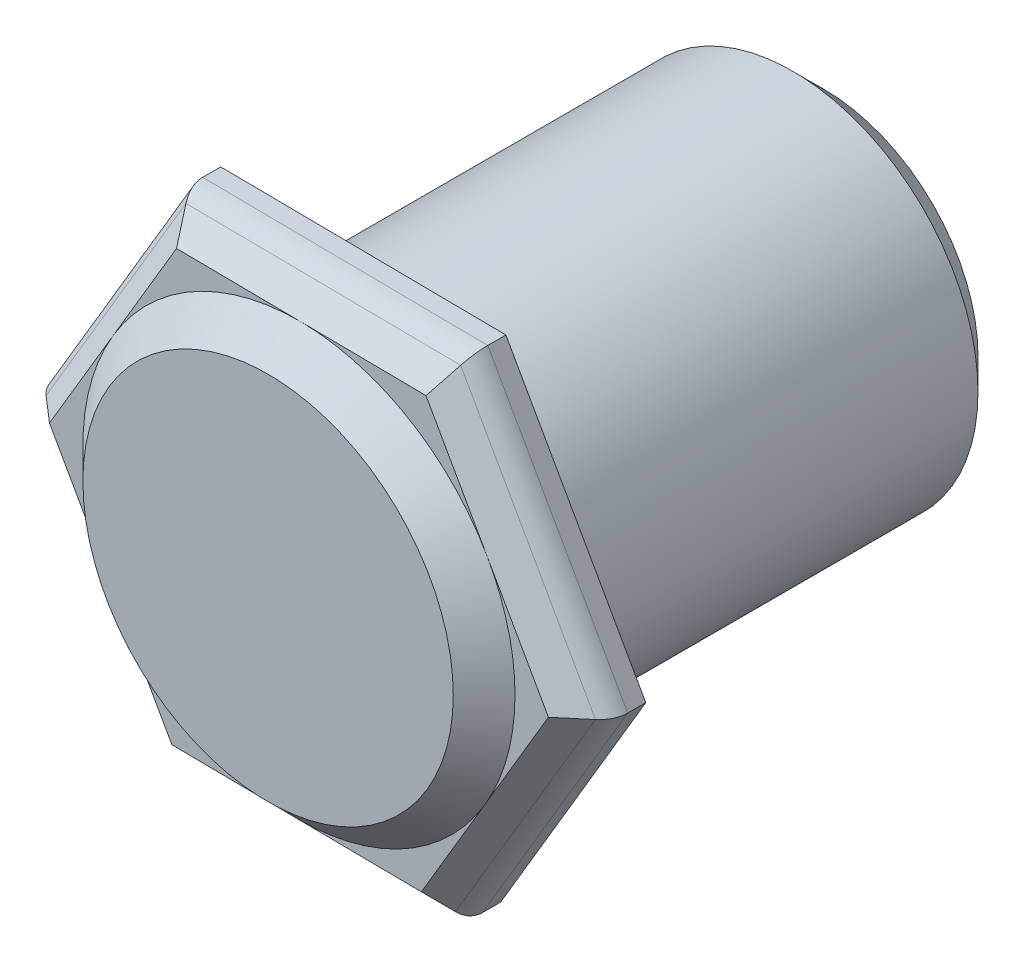
ISO-10303-21;
HEADER;
FILE_DESCRIPTION(('STEP AP214'),'2;1');
FILE_NAME('part.step','',(''),(''),'','','');
FILE_SCHEMA(('AUTOMOTIVE_DESIGN { 1 0 10303 214 1 1 1 1 }'));
ENDSEC;
DATA;
#1=APPLICATION_CONTEXT('core data for automotive mechanical design processes');
#2=APPLICATION_PROTOCOL_DEFINITION('international standard','automotive_design',2000,#1);
#3=PRODUCT_CONTEXT('',#1,'mechanical');
#4=PRODUCT('Part','Part','',(#3));
#5=PRODUCT_RELATED_PRODUCT_CATEGORY('part','',(#4));
#6=PRODUCT_DEFINITION_FORMATION('','',#4);
#7=PRODUCT_DEFINITION_CONTEXT('part definition',#1,'design');
#8=PRODUCT_DEFINITION('design','',#6,#7);
#9=PRODUCT_DEFINITION_SHAPE('','',#8);
#10=(LENGTH_UNIT() NAMED_UNIT(*) SI_UNIT(.MILLI.,.METRE.));
#11=(NAMED_UNIT(*) PLANE_ANGLE_UNIT() SI_UNIT($,.RADIAN.));
#12=(NAMED_UNIT(*) SI_UNIT($,.STERADIAN.) SOLID_ANGLE_UNIT());
#13=UNCERTAINTY_MEASURE_WITH_UNIT(LENGTH_MEASURE(1.E-05),#10,'distance_accuracy_value','');
#14=(GEOMETRIC_REPRESENTATION_CONTEXT(3) GLOBAL_UNCERTAINTY_ASSIGNED_CONTEXT((#13)) GLOBAL_UNIT_ASSIGNED_CONTEXT((#10,
#11,#12)) REPRESENTATION_CONTEXT('',''));
#15=CARTESIAN_POINT('',(0.,0.,0.));
#16=DIRECTION('',(0.,0.,1.));
#17=DIRECTION('',(1.,0.,0.));
#18=AXIS2_PLACEMENT_3D('',#15,#16,#17);
#19=CARTESIAN_POINT('',(0.,0.,17.));
#20=DIRECTION('',(0.,0.,1.));
#21=DIRECTION('',(1.,0.,0.));
#22=AXIS2_PLACEMENT_3D('',#19,#20,#21);
#23=PLANE('',#22);
#24=CARTESIAN_POINT('',(0.,0.,17.));
#25=DIRECTION('',(0.,0.,1.));
#26=DIRECTION('',(1.,0.,0.));
#27=AXIS2_PLACEMENT_3D('',#24,#25,#26);
#28=CIRCLE('',#27,7.);
#29=CARTESIAN_POINT('',(6.09914109727856,3.43518236422575,17.));
#30=VERTEX_POINT('',#29);
#31=CARTESIAN_POINT('',(0.0746153545874957,6.99960231362181,17.));
#32=VERTEX_POINT('',#31);
#33=EDGE_CURVE('E323',#30,#32,#28,.T.);
#34=ORIENTED_EDGE('',*,*,#33,.F.);
#35=DIRECTION('',(-0.490740337746536,0.871305871039795,0.));
#36=VECTOR('',#35,1.);
#37=CARTESIAN_POINT('',(3.8325085684772,7.45957179775637,17.));
#38=LINE('',#37,#36);
#39=CARTESIAN_POINT('',(4.11583763457737,6.95652311856504,17.));
#40=VERTEX_POINT('',#39);
#41=EDGE_CURVE('E243',#30,#40,#38,.T.);
#42=ORIENTED_EDGE('',*,*,#41,.T.);
#43=DIRECTION('',(-0.999943187660259,0.0106593363696422,0.));
#44=VECTOR('',#43,1.);
#45=CARTESIAN_POINT('',(-4.54392439397236,7.04883567940098,17.));
#46=LINE('',#45,#44);
#47=EDGE_CURVE('E239',#40,#32,#46,.T.);
#48=ORIENTED_EDGE('',*,*,#47,.T.);
#49=EDGE_LOOP('',(#34,#42,#48));
#50=FACE_BOUND('',#49,.T.);
#51=ADVANCED_FACE('F43',(#50),#23,.T.);
#52=CARTESIAN_POINT('',(-6.02452574269107,3.56441994939606,17.));
#53=VERTEX_POINT('',#52);
#54=EDGE_CURVE('E324',#32,#53,#28,.T.);
#55=ORIENTED_EDGE('',*,*,#54,.F.);
#56=DIRECTION('',(-0.999943187660259,0.0106593363696422,0.));
#57=VECTOR('',#56,1.);
#58=CARTESIAN_POINT('',(-4.54392439397236,7.04883567940098,17.));
#59=LINE('',#58,#57);
#60=CARTESIAN_POINT('',(-3.96660692540238,7.04268150867858,17.));
#61=VERTEX_POINT('',#60);
#62=EDGE_CURVE('E240',#32,#61,#59,.T.);
#63=ORIENTED_EDGE('',*,*,#62,.T.);
#64=DIRECTION('',(-0.509202849913723,-0.860646534670153,0.));
#65=VECTOR('',#64,1.);
#66=CARTESIAN_POINT('',(-8.37643296244957,-0.410736118355392,17.));
#67=LINE('',#66,#65);
#68=EDGE_CURVE('E229',#61,#53,#67,.T.);
#69=ORIENTED_EDGE('',*,*,#68,.T.);
#70=EDGE_LOOP('',(#55,#63,#69));
#71=FACE_BOUND('',#70,.T.);
#72=ADVANCED_FACE('F351',(#71),#23,.T.);
#73=DIRECTION('',(0.509202849913723,0.860646534670153,0.));
#74=VECTOR('',#73,1.);
#75=CARTESIAN_POINT('',(8.37643296244957,0.410736118355392,17.));
#76=LINE('',#75,#74);
#77=CARTESIAN_POINT('',(6.02452574269107,-3.56441994939606,17.));
#78=VERTEX_POINT('',#77);
#79=CARTESIAN_POINT('',(8.08244455997976,-0.0861583901135376,17.));
#80=VERTEX_POINT('',#79);
#81=EDGE_CURVE('E233',#78,#80,#76,.T.);
#82=ORIENTED_EDGE('',*,*,#81,.T.);
#83=DIRECTION('',(-0.490740337746536,0.871305871039795,0.));
#84=VECTOR('',#83,1.);
#85=CARTESIAN_POINT('',(3.8325085684772,7.45957179775637,17.));
#86=LINE('',#85,#84);
#87=EDGE_CURVE('E231',#80,#30,#86,.T.);
#88=ORIENTED_EDGE('',*,*,#87,.T.);
#89=CARTESIAN_POINT('',(7.,0.,17.));
#90=VERTEX_POINT('',#89);
#91=EDGE_CURVE('E186',#90,#30,#28,.T.);
#92=ORIENTED_EDGE('',*,*,#91,.F.);
#93=EDGE_CURVE('E209',#78,#90,#28,.T.);
#94=ORIENTED_EDGE('',*,*,#93,.F.);
#95=EDGE_LOOP('',(#82,#88,#92,#94));
#96=FACE_BOUND('',#95,.T.);
#97=ADVANCED_FACE('F317',(#96),#23,.T.);
#98=CARTESIAN_POINT('',(-6.09914109727856,-3.43518236422575,17.));
#99=VERTEX_POINT('',#98);
#100=EDGE_CURVE('E327',#53,#99,#28,.T.);
#101=ORIENTED_EDGE('',*,*,#100,.F.);
#102=DIRECTION('',(-0.509202849913723,-0.860646534670153,0.));
#103=VECTOR('',#102,1.);
#104=CARTESIAN_POINT('',(-8.37643296244957,-0.410736118355392,17.));
#105=LINE('',#104,#103);
#106=CARTESIAN_POINT('',(-8.08244455997976,0.0861583901135374,17.));
#107=VERTEX_POINT('',#106);
#108=EDGE_CURVE('E230',#53,#107,#105,.T.);
#109=ORIENTED_EDGE('',*,*,#108,.T.);
#110=DIRECTION('',(0.490740337746536,-0.871305871039795,0.));
#111=VECTOR('',#110,1.);
#112=CARTESIAN_POINT('',(-3.8325085684772,-7.45957179775637,17.));
#113=LINE('',#112,#111);
#114=EDGE_CURVE('E225',#107,#99,#113,.T.);
#115=ORIENTED_EDGE('',*,*,#114,.T.);
#116=EDGE_LOOP('',(#101,#109,#115));
#117=FACE_BOUND('',#116,.T.);
#118=ADVANCED_FACE('F341',(#117),#23,.T.);
#119=DIRECTION('',(0.999943187660258,-0.0106593363696419,0.));
#120=VECTOR('',#119,1.);
#121=CARTESIAN_POINT('',(4.54392439397236,-7.04883567940098,17.));
#122=LINE('',#121,#120);
#123=CARTESIAN_POINT('',(-0.0746153545874931,-6.99960231362181,17.));
#124=VERTEX_POINT('',#123);
#125=CARTESIAN_POINT('',(3.96660692540238,-7.04268150867858,17.));
#126=VERTEX_POINT('',#125);
#127=EDGE_CURVE('E212',#124,#126,#122,.T.);
#128=ORIENTED_EDGE('',*,*,#127,.T.);
#129=DIRECTION('',(0.509202849913723,0.860646534670153,0.));
#130=VECTOR('',#129,1.);
#131=CARTESIAN_POINT('',(8.37643296244957,0.410736118355392,17.));
#132=LINE('',#131,#130);
#133=EDGE_CURVE('E221',#126,#78,#132,.T.);
#134=ORIENTED_EDGE('',*,*,#133,.T.);
#135=EDGE_CURVE('E316',#124,#78,#28,.T.);
#136=ORIENTED_EDGE('',*,*,#135,.F.);
#137=EDGE_LOOP('',(#128,#134,#136));
#138=FACE_BOUND('',#137,.T.);
#139=ADVANCED_FACE('F312',(#138),#23,.T.);
#140=CARTESIAN_POINT('',(0.,0.,15.));
#141=DIRECTION('',(0.,0.,-1.));
#142=DIRECTION('',(-1.,0.,0.));
#143=AXIS2_PLACEMENT_3D('',#140,#141,#142);
#144=CYLINDRICAL_SURFACE('',#143,6.);
#145=CARTESIAN_POINT('',(0.,0.,1.));
#146=DIRECTION('',(0.,0.,1.));
#147=DIRECTION('',(1.,0.,0.));
#148=AXIS2_PLACEMENT_3D('',#145,#146,#147);
#149=CIRCLE('',#148,6.);
#150=CARTESIAN_POINT('',(6.,0.,1.));
#151=VERTEX_POINT('',#150);
#152=EDGE_CURVE('E211',#151,#151,#149,.T.);
#153=ORIENTED_EDGE('',*,*,#152,.T.);
#154=EDGE_LOOP('',(#153));
#155=FACE_BOUND('',#154,.T.);
#156=CARTESIAN_POINT('',(0.,0.,15.));
#157=DIRECTION('',(0.,0.,1.));
#158=DIRECTION('',(1.,0.,0.));
#159=AXIS2_PLACEMENT_3D('',#156,#157,#158);
#160=CIRCLE('',#159,6.);
#161=CARTESIAN_POINT('',(6.,0.,15.));
#162=VERTEX_POINT('',#161);
#163=EDGE_CURVE('E167',#162,#162,#160,.T.);
#164=ORIENTED_EDGE('',*,*,#163,.F.);
#165=EDGE_LOOP('',(#164));
#166=FACE_BOUND('',#165,.T.);
#167=ADVANCED_FACE('F355',(#155,#166),#144,.T.);
#168=CARTESIAN_POINT('',(9.23707949711972,-0.0984667315583298,17.));
#169=DIRECTION('',(-0.871305871039795,-0.490740337746536,0.));
#170=DIRECTION('',(0.490740337746536,-0.871305871039795,0.));
#171=AXIS2_PLACEMENT_3D('',#168,#169,#170);
#172=PLANE('',#171);
#173=DIRECTION('',(0.,0.,-1.));
#174=VECTOR('',#173,1.);
#175=CARTESIAN_POINT('',(4.70381443951699,7.9503121355029,17.));
#176=LINE('',#175,#174);
#177=CARTESIAN_POINT('',(4.70381443951699,7.9503121355029,15.5857864376269));
#178=VERTEX_POINT('',#177);
#179=CARTESIAN_POINT('',(4.70381443951699,7.9503121355029,15.));
#180=VERTEX_POINT('',#179);
#181=EDGE_CURVE('E156',#178,#180,#176,.T.);
#182=ORIENTED_EDGE('',*,*,#181,.F.);
#183=DIRECTION('',(0.490740337746536,-0.871305871039795,0.));
#184=VECTOR('',#183,1.);
#185=CARTESIAN_POINT('',(9.23707949711972,-0.0984667315583297,15.5857864376269));
#186=LINE('',#185,#184);
#187=CARTESIAN_POINT('',(9.23707949711972,-0.0984667315583298,15.5857864376269));
#188=VERTEX_POINT('',#187);
#189=EDGE_CURVE('E257',#178,#188,#186,.T.);
#190=ORIENTED_EDGE('',*,*,#189,.T.);
#191=DIRECTION('',(0.,0.,-1.));
#192=VECTOR('',#191,1.);
#193=CARTESIAN_POINT('',(9.23707949711972,-0.0984667315583298,17.));
#194=LINE('',#193,#192);
#195=CARTESIAN_POINT('',(9.23707949711972,-0.0984667315583298,15.));
#196=VERTEX_POINT('',#195);
#197=EDGE_CURVE('E176',#188,#196,#194,.T.);
#198=ORIENTED_EDGE('',*,*,#197,.T.);
#199=DIRECTION('',(-0.490740337746536,0.871305871039795,0.));
#200=VECTOR('',#199,1.);
#201=CARTESIAN_POINT('',(9.23707949711972,-0.0984667315583298,15.));
#202=LINE('',#201,#200);
#203=EDGE_CURVE('E171',#196,#180,#202,.T.);
#204=ORIENTED_EDGE('',*,*,#203,.T.);
#205=EDGE_LOOP('',(#182,#190,#198,#204));
#206=FACE_BOUND('',#205,.T.);
#207=ADVANCED_FACE('F178',(#206),#172,.F.);
#208=CARTESIAN_POINT('',(4.70381443951699,7.9503121355029,17.));
#209=DIRECTION('',(-0.0106593363696422,-0.999943187660259,0.));
#210=DIRECTION('',(0.999943187660259,-0.0106593363696422,0.));
#211=AXIS2_PLACEMENT_3D('',#208,#209,#210);
#212=PLANE('',#211);
#213=DIRECTION('',(0.,0.,-1.));
#214=VECTOR('',#213,1.);
#215=CARTESIAN_POINT('',(-4.53326505760272,8.04877886706123,17.));
#216=LINE('',#215,#214);
#217=CARTESIAN_POINT('',(-4.53326505760272,8.04877886706123,15.5857864376269));
#218=VERTEX_POINT('',#217);
#219=CARTESIAN_POINT('',(-4.53326505760272,8.04877886706123,15.));
#220=VERTEX_POINT('',#219);
#221=EDGE_CURVE('E170',#218,#220,#216,.T.);
#222=ORIENTED_EDGE('',*,*,#221,.F.);
#223=DIRECTION('',(0.999943187660259,-0.0106593363696422,0.));
#224=VECTOR('',#223,1.);
#225=CARTESIAN_POINT('',(4.70381443951699,7.9503121355029,15.5857864376269));
#226=LINE('',#225,#224);
#227=EDGE_CURVE('E162',#218,#178,#226,.T.);
#228=ORIENTED_EDGE('',*,*,#227,.T.);
#229=ORIENTED_EDGE('',*,*,#181,.T.);
#230=DIRECTION('',(-0.999943187660258,0.0106593363696422,0.));
#231=VECTOR('',#230,1.);
#232=CARTESIAN_POINT('',(4.70381443951699,7.9503121355029,15.));
#233=LINE('',#232,#231);
#234=EDGE_CURVE('E159',#180,#220,#233,.T.);
#235=ORIENTED_EDGE('',*,*,#234,.T.);
#236=EDGE_LOOP('',(#222,#228,#229,#235));
#237=FACE_BOUND('',#236,.T.);
#238=ADVANCED_FACE('F157',(#237),#212,.F.);
#239=CARTESIAN_POINT('',(-4.53326505760272,8.04877886706123,17.));
#240=DIRECTION('',(0.860646534670153,-0.509202849913723,0.));
#241=DIRECTION('',(0.509202849913723,0.860646534670153,0.));
#242=AXIS2_PLACEMENT_3D('',#239,#240,#241);
#243=PLANE('',#242);
#244=DIRECTION('',(0.,0.,-1.));
#245=VECTOR('',#244,1.);
#246=CARTESIAN_POINT('',(-9.23707949711972,0.0984667315583298,17.));
#247=LINE('',#246,#245);
#248=CARTESIAN_POINT('',(-9.23707949711972,0.0984667315583298,15.5857864376269));
#249=VERTEX_POINT('',#248);
#250=CARTESIAN_POINT('',(-9.23707949711972,0.0984667315583298,15.));
#251=VERTEX_POINT('',#250);
#252=EDGE_CURVE('E202',#249,#251,#247,.T.);
#253=ORIENTED_EDGE('',*,*,#252,.F.);
#254=DIRECTION('',(0.509202849913723,0.860646534670153,0.));
#255=VECTOR('',#254,1.);
#256=CARTESIAN_POINT('',(-4.53326505760272,8.04877886706123,15.5857864376269));
#257=LINE('',#256,#255);
#258=EDGE_CURVE('E55',#249,#218,#257,.T.);
#259=ORIENTED_EDGE('',*,*,#258,.T.);
#260=ORIENTED_EDGE('',*,*,#221,.T.);
#261=DIRECTION('',(-0.509202849913723,-0.860646534670153,0.));
#262=VECTOR('',#261,1.);
#263=CARTESIAN_POINT('',(-4.53326505760272,8.04877886706123,15.));
#264=LINE('',#263,#262);
#265=EDGE_CURVE('E177',#220,#251,#264,.T.);
#266=ORIENTED_EDGE('',*,*,#265,.T.);
#267=EDGE_LOOP('',(#253,#259,#260,#266));
#268=FACE_BOUND('',#267,.T.);
#269=ADVANCED_FACE('F384',(#268),#243,.F.);
#270=CARTESIAN_POINT('',(-9.23707949711972,0.0984667315583298,17.));
#271=DIRECTION('',(0.871305871039795,0.490740337746536,0.));
#272=DIRECTION('',(-0.490740337746536,0.871305871039795,0.));
#273=AXIS2_PLACEMENT_3D('',#270,#271,#272);
#274=PLANE('',#273);
#275=DIRECTION('',(0.,0.,-1.));
#276=VECTOR('',#275,1.);
#277=CARTESIAN_POINT('',(-4.70381443951699,-7.9503121355029,17.));
#278=LINE('',#277,#276);
#279=CARTESIAN_POINT('',(-4.70381443951699,-7.9503121355029,15.5857864376269));
#280=VERTEX_POINT('',#279);
#281=CARTESIAN_POINT('',(-4.70381443951699,-7.9503121355029,15.));
#282=VERTEX_POINT('',#281);
#283=EDGE_CURVE('E201',#280,#282,#278,.T.);
#284=ORIENTED_EDGE('',*,*,#283,.F.);
#285=DIRECTION('',(-0.490740337746536,0.871305871039795,0.));
#286=VECTOR('',#285,1.);
#287=CARTESIAN_POINT('',(-9.23707949711972,0.0984667315583297,15.5857864376269));
#288=LINE('',#287,#286);
#289=EDGE_CURVE('E67',#280,#249,#288,.T.);
#290=ORIENTED_EDGE('',*,*,#289,.T.);
#291=ORIENTED_EDGE('',*,*,#252,.T.);
#292=DIRECTION('',(0.490740337746536,-0.871305871039795,0.));
#293=VECTOR('',#292,1.);
#294=CARTESIAN_POINT('',(-9.23707949711972,0.0984667315583298,15.));
#295=LINE('',#294,#293);
#296=EDGE_CURVE('E195',#251,#282,#295,.T.);
#297=ORIENTED_EDGE('',*,*,#296,.T.);
#298=EDGE_LOOP('',(#284,#290,#291,#297));
#299=FACE_BOUND('',#298,.T.);
#300=ADVANCED_FACE('F377',(#299),#274,.F.);
#301=CARTESIAN_POINT('',(-4.70381443951699,-7.9503121355029,17.));
#302=DIRECTION('',(0.0106593363696419,0.999943187660258,0.));
#303=DIRECTION('',(-0.999943187660258,0.0106593363696419,0.));
#304=AXIS2_PLACEMENT_3D('',#301,#302,#303);
#305=PLANE('',#304);
#306=DIRECTION('',(0.,0.,-1.));
#307=VECTOR('',#306,1.);
#308=CARTESIAN_POINT('',(4.53326505760272,-8.04877886706123,17.));
#309=LINE('',#308,#307);
#310=CARTESIAN_POINT('',(4.53326505760272,-8.04877886706123,15.5857864376269));
#311=VERTEX_POINT('',#310);
#312=CARTESIAN_POINT('',(4.53326505760272,-8.04877886706123,15.));
#313=VERTEX_POINT('',#312);
#314=EDGE_CURVE('E203',#311,#313,#309,.T.);
#315=ORIENTED_EDGE('',*,*,#314,.F.);
#316=DIRECTION('',(-0.999943187660258,0.0106593363696419,0.));
#317=VECTOR('',#316,1.);
#318=CARTESIAN_POINT('',(-4.70381443951699,-7.9503121355029,15.5857864376269));
#319=LINE('',#318,#317);
#320=EDGE_CURVE('E268',#311,#280,#319,.T.);
#321=ORIENTED_EDGE('',*,*,#320,.T.);
#322=ORIENTED_EDGE('',*,*,#283,.T.);
#323=DIRECTION('',(0.999943187660259,-0.0106593363696419,0.));
#324=VECTOR('',#323,1.);
#325=CARTESIAN_POINT('',(-4.70381443951699,-7.9503121355029,15.));
#326=LINE('',#325,#324);
#327=EDGE_CURVE('E191',#282,#313,#326,.T.);
#328=ORIENTED_EDGE('',*,*,#327,.T.);
#329=EDGE_LOOP('',(#315,#321,#322,#328));
#330=FACE_BOUND('',#329,.T.);
#331=ADVANCED_FACE('F375',(#330),#305,.F.);
#332=CARTESIAN_POINT('',(4.53326505760272,-8.04877886706123,17.));
#333=DIRECTION('',(-0.860646534670153,0.509202849913723,0.));
#334=DIRECTION('',(-0.509202849913723,-0.860646534670153,0.));
#335=AXIS2_PLACEMENT_3D('',#332,#333,#334);
#336=PLANE('',#335);
#337=ORIENTED_EDGE('',*,*,#197,.F.);
#338=DIRECTION('',(-0.509202849913723,-0.860646534670153,0.));
#339=VECTOR('',#338,1.);
#340=CARTESIAN_POINT('',(4.53326505760272,-8.04877886706123,15.5857864376269));
#341=LINE('',#340,#339);
#342=EDGE_CURVE('E262',#188,#311,#341,.T.);
#343=ORIENTED_EDGE('',*,*,#342,.T.);
#344=ORIENTED_EDGE('',*,*,#314,.T.);
#345=DIRECTION('',(0.509202849913723,0.860646534670153,0.));
#346=VECTOR('',#345,1.);
#347=CARTESIAN_POINT('',(4.53326505760272,-8.04877886706123,15.));
#348=LINE('',#347,#346);
#349=EDGE_CURVE('E196',#313,#196,#348,.T.);
#350=ORIENTED_EDGE('',*,*,#349,.T.);
#351=EDGE_LOOP('',(#337,#343,#344,#350));
#352=FACE_BOUND('',#351,.T.);
#353=ADVANCED_FACE('F365',(#352),#336,.F.);
#354=EDGE_CURVE('E325',#99,#124,#28,.T.);
#355=ORIENTED_EDGE('',*,*,#354,.F.);
#356=DIRECTION('',(0.490740337746536,-0.871305871039795,0.));
#357=VECTOR('',#356,1.);
#358=CARTESIAN_POINT('',(-3.8325085684772,-7.45957179775637,17.));
#359=LINE('',#358,#357);
#360=CARTESIAN_POINT('',(-4.11583763457737,-6.95652311856504,17.));
#361=VERTEX_POINT('',#360);
#362=EDGE_CURVE('E218',#99,#361,#359,.T.);
#363=ORIENTED_EDGE('',*,*,#362,.T.);
#364=DIRECTION('',(0.999943187660258,-0.0106593363696419,0.));
#365=VECTOR('',#364,1.);
#366=CARTESIAN_POINT('',(4.54392439397236,-7.04883567940098,17.));
#367=LINE('',#366,#365);
#368=EDGE_CURVE('E220',#361,#124,#367,.T.);
#369=ORIENTED_EDGE('',*,*,#368,.T.);
#370=EDGE_LOOP('',(#355,#363,#369));
#371=FACE_BOUND('',#370,.T.);
#372=ADVANCED_FACE('F336',(#371),#23,.T.);
#373=CARTESIAN_POINT('',(0.,0.,15.));
#374=DIRECTION('',(0.,0.,1.));
#375=DIRECTION('',(1.,0.,0.));
#376=AXIS2_PLACEMENT_3D('',#373,#374,#375);
#377=PLANE('',#376);
#378=ORIENTED_EDGE('',*,*,#163,.T.);
#379=EDGE_LOOP('',(#378));
#380=FACE_BOUND('',#379,.T.);
#381=ORIENTED_EDGE('',*,*,#203,.F.);
#382=ORIENTED_EDGE('',*,*,#349,.F.);
#383=ORIENTED_EDGE('',*,*,#327,.F.);
#384=ORIENTED_EDGE('',*,*,#296,.F.);
#385=ORIENTED_EDGE('',*,*,#265,.F.);
#386=ORIENTED_EDGE('',*,*,#234,.F.);
#387=EDGE_LOOP('',(#381,#382,#383,#384,#385,#386));
#388=FACE_BOUND('',#387,.T.);
#389=ADVANCED_FACE('F173',(#380,#388),#377,.F.);
#390=CARTESIAN_POINT('',(0.,0.,18.));
#391=DIRECTION('',(0.,0.,1.));
#392=DIRECTION('',(1.,0.,0.));
#393=AXIS2_PLACEMENT_3D('',#390,#391,#392);
#394=PLANE('',#393);
#395=CARTESIAN_POINT('',(0.,0.,18.));
#396=DIRECTION('',(0.,0.,1.));
#397=DIRECTION('',(1.,0.,0.));
#398=AXIS2_PLACEMENT_3D('',#395,#396,#397);
#399=CIRCLE('',#398,5.99999999999999);
#400=CARTESIAN_POINT('',(5.99999999999999,0.,18.));
#401=VERTEX_POINT('',#400);
#402=EDGE_CURVE('E241',#401,#401,#399,.T.);
#403=ORIENTED_EDGE('',*,*,#402,.T.);
#404=EDGE_LOOP('',(#403));
#405=FACE_BOUND('',#404,.T.);
#406=ADVANCED_FACE('F369',(#405),#394,.T.);
#407=CARTESIAN_POINT('',(0.,0.,1.));
#408=DIRECTION('',(0.,0.,1.));
#409=DIRECTION('',(1.,0.,0.));
#410=AXIS2_PLACEMENT_3D('',#407,#408,#409);
#411=CONICAL_SURFACE('',#410,6.,0.78539816339745);
#412=CARTESIAN_POINT('',(0.,0.,0.));
#413=DIRECTION('',(0.,0.,-1.));
#414=DIRECTION('',(-1.,0.,0.));
#415=AXIS2_PLACEMENT_3D('',#412,#413,#414);
#416=CIRCLE('',#415,5.);
#417=CARTESIAN_POINT('',(-5.,0.,0.));
#418=VERTEX_POINT('',#417);
#419=EDGE_CURVE('E639',#418,#418,#416,.T.);
#420=ORIENTED_EDGE('',*,*,#419,.F.);
#421=EDGE_LOOP('',(#420));
#422=FACE_BOUND('',#421,.T.);
#423=ORIENTED_EDGE('',*,*,#152,.F.);
#424=EDGE_LOOP('',(#423));
#425=FACE_BOUND('',#424,.T.);
#426=ADVANCED_FACE('F397',(#422,#425),#411,.T.);
#427=CARTESIAN_POINT('',(6.02452574269107,-3.56441994939606,17.));
#428=DIRECTION('',(0.608569000869969,-0.36006078817351,0.707106781186546));
#429=DIRECTION('',(-0.509202849913723,-0.860646534670153,0.));
#430=AXIS2_PLACEMENT_3D('',#427,#428,#429);
#431=PLANE('',#430);
#432=DIRECTION('',(-0.37096482628148,0.658645328754802,0.654653670707979));
#433=VECTOR('',#432,1.);
#434=CARTESIAN_POINT('',(3.39994879320204,-6.03658415029593,18.));
#435=LINE('',#434,#433);
#436=CARTESIAN_POINT('',(4.36729473329575,-7.75409977332482,16.2928932188135));
#437=VERTEX_POINT('',#436);
#438=EDGE_CURVE('E183',#437,#126,#435,.T.);
#439=ORIENTED_EDGE('',*,*,#438,.F.);
#440=DIRECTION('',(-0.509202849913723,-0.860646534670153,0.));
#441=VECTOR('',#440,1.);
#442=CARTESIAN_POINT('',(8.98500196331954,0.0506753301818837,16.2928932188135));
#443=LINE('',#442,#441);
#444=CARTESIAN_POINT('',(8.89889475382633,-0.0948617018143099,16.2928932188135));
#445=VERTEX_POINT('',#444);
#446=EDGE_CURVE('E266',#437,#445,#443,.F.);
#447=ORIENTED_EDGE('',*,*,#446,.T.);
#448=DIRECTION('',(-0.755885999926352,0.00805770090716006,0.654653670707978));
#449=VECTOR('',#448,1.);
#450=CARTESIAN_POINT('',(6.9278096228398,-0.0738500486687464,18.));
#451=LINE('',#450,#449);
#452=EDGE_CURVE('E185',#80,#445,#451,.F.);
#453=ORIENTED_EDGE('',*,*,#452,.F.);
#454=ORIENTED_EDGE('',*,*,#81,.F.);
#455=ORIENTED_EDGE('',*,*,#133,.F.);
#456=EDGE_LOOP('',(#439,#447,#453,#454,#455));
#457=FACE_BOUND('',#456,.T.);
#458=ADVANCED_FACE('F310',(#457),#431,.T.);
#459=CARTESIAN_POINT('',(6.09914109727857,3.43518236422575,17.));
#460=DIRECTION('',(0.616106289899892,0.347005820622353,0.707106781186546));
#461=DIRECTION('',(0.490740337746536,-0.871305871039795,0.));
#462=AXIS2_PLACEMENT_3D('',#459,#460,#461);
#463=PLANE('',#462);
#464=ORIENTED_EDGE('',*,*,#452,.T.);
#465=DIRECTION('',(0.490740337746536,-0.871305871039795,0.));
#466=VECTOR('',#465,1.);
#467=CARTESIAN_POINT('',(4.44861485837709,7.80657761837872,16.2928932188135));
#468=LINE('',#467,#466);
#469=CARTESIAN_POINT('',(4.53160002053058,7.65923807151052,16.2928932188135));
#470=VERTEX_POINT('',#469);
#471=EDGE_CURVE('E265',#445,#470,#468,.F.);
#472=ORIENTED_EDGE('',*,*,#471,.T.);
#473=DIRECTION('',(-0.384921173644873,-0.650587627847642,0.654653670707979));
#474=VECTOR('',#473,1.);
#475=CARTESIAN_POINT('',(3.52786082963775,5.96273410162719,18.));
#476=LINE('',#475,#474);
#477=EDGE_CURVE('E252',#40,#470,#476,.F.);
#478=ORIENTED_EDGE('',*,*,#477,.F.);
#479=ORIENTED_EDGE('',*,*,#41,.F.);
#480=ORIENTED_EDGE('',*,*,#87,.F.);
#481=EDGE_LOOP('',(#464,#472,#478,#479,#480));
#482=FACE_BOUND('',#481,.T.);
#483=ADVANCED_FACE('F430',(#482),#463,.T.);
#484=CARTESIAN_POINT('',(-0.0746153545874931,-6.99960231362181,17.));
#485=DIRECTION('',(-0.00753728902992218,-0.707066608795863,0.707106781186546));
#486=DIRECTION('',(-0.999943187660258,0.0106593363696419,0.));
#487=AXIS2_PLACEMENT_3D('',#484,#485,#486);
#488=PLANE('',#487);
#489=DIRECTION('',(-0.384921173644873,-0.650587627847642,-0.654653670707979));
#490=VECTOR('',#489,1.);
#491=CARTESIAN_POINT('',(-3.52786082963775,-5.96273410162719,18.));
#492=LINE('',#491,#490);
#493=CARTESIAN_POINT('',(-4.53160002053058,-7.65923807151052,16.2928932188135));
#494=VERTEX_POINT('',#493);
#495=EDGE_CURVE('E246',#494,#361,#492,.F.);
#496=ORIENTED_EDGE('',*,*,#495,.F.);
#497=DIRECTION('',(-0.999943187660258,0.0106593363696419,0.));
#498=VECTOR('',#497,1.);
#499=CARTESIAN_POINT('',(4.53638710494244,-7.75590228819684,16.2928932188135));
#500=LINE('',#499,#498);
#501=EDGE_CURVE('E269',#494,#437,#500,.F.);
#502=ORIENTED_EDGE('',*,*,#501,.T.);
#503=ORIENTED_EDGE('',*,*,#438,.T.);
#504=ORIENTED_EDGE('',*,*,#127,.F.);
#505=ORIENTED_EDGE('',*,*,#368,.F.);
#506=EDGE_LOOP('',(#496,#502,#503,#504,#505));
#507=FACE_BOUND('',#506,.T.);
#508=ADVANCED_FACE('F304',(#507),#488,.T.);
#509=CARTESIAN_POINT('',(0.0746153545874958,6.99960231362181,17.));
#510=DIRECTION('',(0.00753728902992245,0.707066608795863,0.707106781186546));
#511=DIRECTION('',(0.999943187660259,-0.0106593363696422,0.));
#512=AXIS2_PLACEMENT_3D('',#509,#510,#511);
#513=PLANE('',#512);
#514=ORIENTED_EDGE('',*,*,#477,.T.);
#515=DIRECTION('',(0.999943187660258,-0.0106593363696422,0.));
#516=VECTOR('',#515,1.);
#517=CARTESIAN_POINT('',(-4.53638710494244,7.75590228819684,16.2928932188135));
#518=LINE('',#517,#516);
#519=CARTESIAN_POINT('',(-4.36729473329575,7.75409977332483,16.2928932188135));
#520=VERTEX_POINT('',#519);
#521=EDGE_CURVE('E260',#470,#520,#518,.F.);
#522=ORIENTED_EDGE('',*,*,#521,.T.);
#523=DIRECTION('',(0.370964826281479,-0.658645328754802,0.654653670707979));
#524=VECTOR('',#523,1.);
#525=CARTESIAN_POINT('',(-3.39994879320204,6.03658415029593,18.));
#526=LINE('',#525,#524);
#527=EDGE_CURVE('E248',#61,#520,#526,.F.);
#528=ORIENTED_EDGE('',*,*,#527,.F.);
#529=ORIENTED_EDGE('',*,*,#62,.F.);
#530=ORIENTED_EDGE('',*,*,#47,.F.);
#531=EDGE_LOOP('',(#514,#522,#528,#529,#530));
#532=FACE_BOUND('',#531,.T.);
#533=ADVANCED_FACE('F411',(#532),#513,.T.);
#534=CARTESIAN_POINT('',(-6.09914109727857,-3.43518236422575,17.));
#535=DIRECTION('',(-0.616106289899892,-0.347005820622353,0.707106781186546));
#536=DIRECTION('',(-0.490740337746536,0.871305871039795,0.));
#537=AXIS2_PLACEMENT_3D('',#534,#535,#536);
#538=PLANE('',#537);
#539=DIRECTION('',(-0.755885999926352,0.0080577009071599,-0.654653670707978));
#540=VECTOR('',#539,1.);
#541=CARTESIAN_POINT('',(-6.9278096228398,0.0738500486687469,18.));
#542=LINE('',#541,#540);
#543=CARTESIAN_POINT('',(-8.89889475382633,0.0948617018143099,16.2928932188135));
#544=VERTEX_POINT('',#543);
#545=EDGE_CURVE('E247',#544,#107,#542,.F.);
#546=ORIENTED_EDGE('',*,*,#545,.F.);
#547=DIRECTION('',(-0.490740337746536,0.871305871039795,0.));
#548=VECTOR('',#547,1.);
#549=CARTESIAN_POINT('',(-4.44861485837709,-7.80657761837872,16.2928932188135));
#550=LINE('',#549,#548);
#551=EDGE_CURVE('E272',#544,#494,#550,.F.);
#552=ORIENTED_EDGE('',*,*,#551,.T.);
#553=ORIENTED_EDGE('',*,*,#495,.T.);
#554=ORIENTED_EDGE('',*,*,#362,.F.);
#555=ORIENTED_EDGE('',*,*,#114,.F.);
#556=EDGE_LOOP('',(#546,#552,#553,#554,#555));
#557=FACE_BOUND('',#556,.T.);
#558=ADVANCED_FACE('F342',(#557),#538,.T.);
#559=CARTESIAN_POINT('',(-6.02452574269107,3.56441994939606,17.));
#560=DIRECTION('',(-0.608569000869969,0.36006078817351,0.707106781186546));
#561=DIRECTION('',(0.509202849913723,0.860646534670153,0.));
#562=AXIS2_PLACEMENT_3D('',#559,#560,#561);
#563=PLANE('',#562);
#564=ORIENTED_EDGE('',*,*,#527,.T.);
#565=DIRECTION('',(0.509202849913723,0.860646534670153,0.));
#566=VECTOR('',#565,1.);
#567=CARTESIAN_POINT('',(-8.98500196331954,-0.0506753301818821,16.2928932188135));
#568=LINE('',#567,#566);
#569=EDGE_CURVE('E11',#520,#544,#568,.F.);
#570=ORIENTED_EDGE('',*,*,#569,.T.);
#571=ORIENTED_EDGE('',*,*,#545,.T.);
#572=ORIENTED_EDGE('',*,*,#108,.F.);
#573=ORIENTED_EDGE('',*,*,#68,.F.);
#574=EDGE_LOOP('',(#564,#570,#571,#572,#573));
#575=FACE_BOUND('',#574,.T.);
#576=ADVANCED_FACE('F345',(#575),#563,.T.);
#577=CARTESIAN_POINT('',(0.,0.,18.));
#578=DIRECTION('',(0.,0.,-1.));
#579=DIRECTION('',(-1.,0.,0.));
#580=AXIS2_PLACEMENT_3D('',#577,#578,#579);
#581=CONICAL_SURFACE('',#580,5.99999999999999,0.785398163397447);
#582=ORIENTED_EDGE('',*,*,#135,.T.);
#583=ORIENTED_EDGE('',*,*,#93,.T.);
#584=ORIENTED_EDGE('',*,*,#91,.T.);
#585=ORIENTED_EDGE('',*,*,#33,.T.);
#586=ORIENTED_EDGE('',*,*,#54,.T.);
#587=ORIENTED_EDGE('',*,*,#100,.T.);
#588=ORIENTED_EDGE('',*,*,#354,.T.);
#589=EDGE_LOOP('',(#582,#583,#584,#585,#586,#587,#588));
#590=FACE_BOUND('',#589,.T.);
#591=ORIENTED_EDGE('',*,*,#402,.F.);
#592=EDGE_LOOP('',(#591));
#593=FACE_BOUND('',#592,.T.);
#594=ADVANCED_FACE('F331',(#590,#593),#581,.T.);
#595=CARTESIAN_POINT('',(-4.69315510314735,-6.95036894784264,15.5857864376269));
#596=DIRECTION('',(0.999943187660258,-0.0106593363696419,0.));
#597=DIRECTION('',(0.0106593363696419,0.999943187660258,0.));
#598=AXIS2_PLACEMENT_3D('',#595,#596,#597);
#599=CYLINDRICAL_SURFACE('',#598,1.);
#600=CARTESIAN_POINT('',(3.96660692540238,-7.04268150867858,15.5857864376269));
#601=DIRECTION('',(0.871305871039795,0.490740337746536,0.));
#602=DIRECTION('',(0.490740337746536,-0.871305871039795,0.));
#603=AXIS2_PLACEMENT_3D('',#600,#601,#602);
#604=ELLIPSE('',#603,1.15470053837925,1.);
#605=EDGE_CURVE('E287',#437,#311,#604,.T.);
#606=ORIENTED_EDGE('',*,*,#605,.F.);
#607=ORIENTED_EDGE('',*,*,#501,.F.);
#608=CARTESIAN_POINT('',(-4.11583763457737,-6.95652311856504,15.5857864376269));
#609=DIRECTION('',(0.860646534670153,-0.509202849913723,0.));
#610=DIRECTION('',(-0.509202849913722,-0.860646534670153,0.));
#611=AXIS2_PLACEMENT_3D('',#608,#609,#610);
#612=ELLIPSE('',#611,1.15470053837925,1.);
#613=EDGE_CURVE('E50',#280,#494,#612,.F.);
#614=ORIENTED_EDGE('',*,*,#613,.F.);
#615=ORIENTED_EDGE('',*,*,#320,.F.);
#616=EDGE_LOOP('',(#606,#607,#614,#615));
#617=FACE_BOUND('',#616,.T.);
#618=ADVANCED_FACE('F44',(#617),#599,.T.);
#619=CARTESIAN_POINT('',(-8.36577362607993,0.589207069304866,15.5857864376269));
#620=DIRECTION('',(0.490740337746536,-0.871305871039795,0.));
#621=DIRECTION('',(0.871305871039795,0.490740337746536,0.));
#622=AXIS2_PLACEMENT_3D('',#619,#620,#621);
#623=CYLINDRICAL_SURFACE('',#622,1.);
#624=ORIENTED_EDGE('',*,*,#613,.T.);
#625=ORIENTED_EDGE('',*,*,#551,.F.);
#626=CARTESIAN_POINT('',(-8.08244455997976,0.0861583901135395,15.5857864376269));
#627=DIRECTION('',(-0.010659336369642,-0.999943187660258,0.));
#628=DIRECTION('',(-0.999943187660258,0.0106593363696421,0.));
#629=AXIS2_PLACEMENT_3D('',#626,#627,#628);
#630=ELLIPSE('',#629,1.15470053837925,1.);
#631=EDGE_CURVE('E282',#249,#544,#630,.F.);
#632=ORIENTED_EDGE('',*,*,#631,.F.);
#633=ORIENTED_EDGE('',*,*,#289,.F.);
#634=EDGE_LOOP('',(#624,#625,#632,#633));
#635=FACE_BOUND('',#634,.T.);
#636=ADVANCED_FACE('F298',(#635),#623,.T.);
#637=CARTESIAN_POINT('',(3.67261852293257,-7.53957601714751,15.5857864376269));
#638=DIRECTION('',(0.509202849913723,0.860646534670153,0.));
#639=DIRECTION('',(-0.860646534670153,0.509202849913723,0.));
#640=AXIS2_PLACEMENT_3D('',#637,#638,#639);
#641=CYLINDRICAL_SURFACE('',#640,1.);
#642=ORIENTED_EDGE('',*,*,#605,.T.);
#643=ORIENTED_EDGE('',*,*,#342,.F.);
#644=CARTESIAN_POINT('',(8.08244455997976,-0.0861583901135362,15.5857864376269));
#645=DIRECTION('',(0.010659336369642,0.999943187660258,0.));
#646=DIRECTION('',(0.999943187660258,-0.0106593363696419,0.));
#647=AXIS2_PLACEMENT_3D('',#644,#645,#646);
#648=ELLIPSE('',#647,1.15470053837925,1.);
#649=EDGE_CURVE('E283',#445,#188,#648,.T.);
#650=ORIENTED_EDGE('',*,*,#649,.F.);
#651=ORIENTED_EDGE('',*,*,#446,.F.);
#652=EDGE_LOOP('',(#642,#643,#650,#651));
#653=FACE_BOUND('',#652,.T.);
#654=ADVANCED_FACE('F455',(#653),#641,.T.);
#655=CARTESIAN_POINT('',(-3.67261852293257,7.53957601714751,15.5857864376269));
#656=DIRECTION('',(-0.509202849913723,-0.860646534670153,0.));
#657=DIRECTION('',(0.860646534670153,-0.509202849913723,0.));
#658=AXIS2_PLACEMENT_3D('',#655,#656,#657);
#659=CYLINDRICAL_SURFACE('',#658,1.);
#660=ORIENTED_EDGE('',*,*,#631,.T.);
#661=ORIENTED_EDGE('',*,*,#569,.F.);
#662=CARTESIAN_POINT('',(-3.96660692540238,7.04268150867858,15.5857864376269));
#663=DIRECTION('',(-0.871305871039795,-0.490740337746536,0.));
#664=DIRECTION('',(0.490740337746536,-0.871305871039795,0.));
#665=AXIS2_PLACEMENT_3D('',#662,#663,#664);
#666=ELLIPSE('',#665,1.15470053837925,1.);
#667=EDGE_CURVE('E279',#218,#520,#666,.F.);
#668=ORIENTED_EDGE('',*,*,#667,.F.);
#669=ORIENTED_EDGE('',*,*,#258,.F.);
#670=EDGE_LOOP('',(#660,#661,#668,#669));
#671=FACE_BOUND('',#670,.T.);
#672=ADVANCED_FACE('F446',(#671),#659,.T.);
#673=CARTESIAN_POINT('',(8.36577362607993,-0.589207069304866,15.5857864376269));
#674=DIRECTION('',(-0.490740337746536,0.871305871039795,0.));
#675=DIRECTION('',(-0.871305871039795,-0.490740337746536,0.));
#676=AXIS2_PLACEMENT_3D('',#673,#674,#675);
#677=CYLINDRICAL_SURFACE('',#676,1.);
#678=ORIENTED_EDGE('',*,*,#649,.T.);
#679=ORIENTED_EDGE('',*,*,#189,.F.);
#680=CARTESIAN_POINT('',(4.11583763457737,6.95652311856504,15.5857864376269));
#681=DIRECTION('',(-0.860646534670153,0.509202849913723,0.));
#682=DIRECTION('',(0.509202849913723,0.860646534670153,0.));
#683=AXIS2_PLACEMENT_3D('',#680,#681,#682);
#684=ELLIPSE('',#683,1.15470053837925,1.);
#685=EDGE_CURVE('E277',#470,#178,#684,.T.);
#686=ORIENTED_EDGE('',*,*,#685,.F.);
#687=ORIENTED_EDGE('',*,*,#471,.F.);
#688=EDGE_LOOP('',(#678,#679,#686,#687));
#689=FACE_BOUND('',#688,.T.);
#690=ADVANCED_FACE('F441',(#689),#677,.T.);
#691=CARTESIAN_POINT('',(4.69315510314735,6.95036894784264,15.5857864376269));
#692=DIRECTION('',(-0.999943187660258,0.0106593363696422,0.));
#693=DIRECTION('',(-0.0106593363696422,-0.999943187660258,0.));
#694=AXIS2_PLACEMENT_3D('',#691,#692,#693);
#695=CYLINDRICAL_SURFACE('',#694,1.);
#696=ORIENTED_EDGE('',*,*,#667,.T.);
#697=ORIENTED_EDGE('',*,*,#521,.F.);
#698=ORIENTED_EDGE('',*,*,#685,.T.);
#699=ORIENTED_EDGE('',*,*,#227,.F.);
#700=EDGE_LOOP('',(#696,#697,#698,#699));
#701=FACE_BOUND('',#700,.T.);
#702=ADVANCED_FACE('F439',(#701),#695,.T.);
#703=CARTESIAN_POINT('',(0.,0.,10.));
#704=DIRECTION('',(0.,0.,-1.));
#705=DIRECTION('',(-1.,0.,0.));
#706=AXIS2_PLACEMENT_3D('',#703,#704,#705);
#707=CYLINDRICAL_SURFACE('',#706,5.);
#708=CARTESIAN_POINT('',(0.,0.,10.));
#709=DIRECTION('',(0.,0.,-1.));
#710=DIRECTION('',(-1.,0.,0.));
#711=AXIS2_PLACEMENT_3D('',#708,#709,#710);
#712=CIRCLE('',#711,5.);
#713=CARTESIAN_POINT('',(-5.,0.,10.));
#714=VERTEX_POINT('',#713);
#715=EDGE_CURVE('E276',#714,#714,#712,.T.);
#716=ORIENTED_EDGE('',*,*,#715,.F.);
#717=EDGE_LOOP('',(#716));
#718=FACE_BOUND('',#717,.T.);
#719=ORIENTED_EDGE('',*,*,#419,.T.);
#720=EDGE_LOOP('',(#719));
#721=FACE_BOUND('',#720,.T.);
#722=ADVANCED_FACE('F444',(#718,#721),#707,.F.);
#723=CARTESIAN_POINT('',(0.,0.,10.));
#724=DIRECTION('',(0.,0.,-1.));
#725=DIRECTION('',(-1.,0.,0.));
#726=AXIS2_PLACEMENT_3D('',#723,#724,#725);
#727=PLANE('',#726);
#728=ORIENTED_EDGE('',*,*,#715,.T.);
#729=EDGE_LOOP('',(#728));
#730=FACE_BOUND('',#729,.T.);
#731=ADVANCED_FACE('F616',(#730),#727,.T.);
#732=CLOSED_SHELL('',(#51,#72,#97,#118,#139,#167,#207,#238,#269,#300,#331,#353,#372,#389,#406,
#426,#458,#483,#508,#533,#558,#576,#594,#618,#636,#654,#672,#690,#702,#722,#731));
#733=MANIFOLD_SOLID_BREP('B2',#732);
#734=ADVANCED_BREP_SHAPE_REPRESENTATION('',(#18,#733),#14);
#735=SHAPE_DEFINITION_REPRESENTATION(#9,#734);
ENDSEC;
END-ISO-10303-21;
